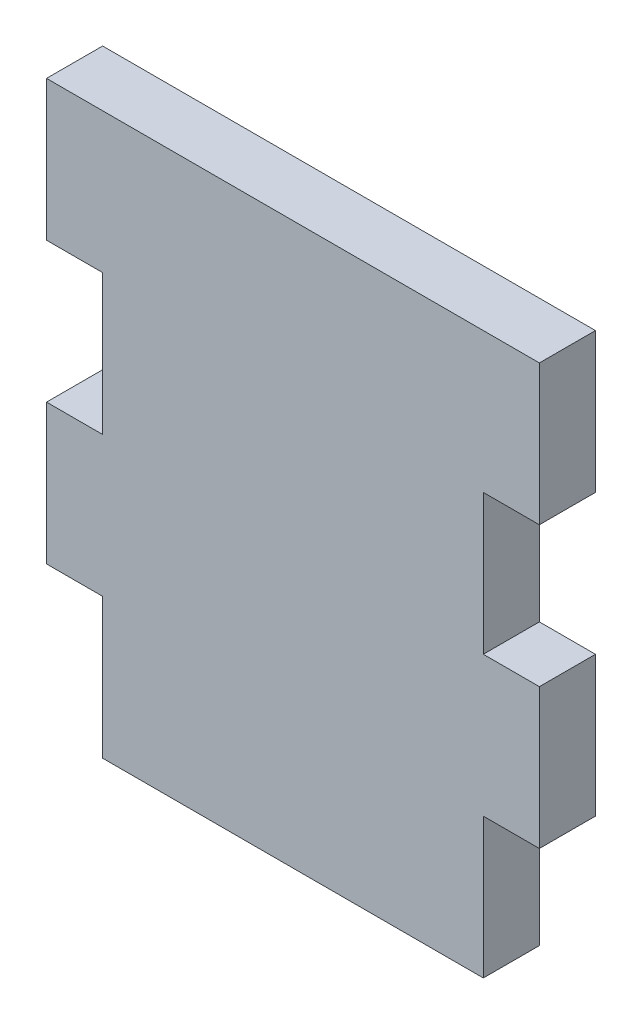
ISO-10303-21;
HEADER;
FILE_DESCRIPTION(('STEP AP214'),'2;1');
FILE_NAME('part.step','',(''),(''),'','','');
FILE_SCHEMA(('AUTOMOTIVE_DESIGN { 1 0 10303 214 1 1 1 1 }'));
ENDSEC;
DATA;
#1=APPLICATION_CONTEXT('core data for automotive mechanical design processes');
#2=APPLICATION_PROTOCOL_DEFINITION('international standard','automotive_design',2000,#1);
#3=PRODUCT_CONTEXT('',#1,'mechanical');
#4=PRODUCT('Part','Part','',(#3));
#5=PRODUCT_RELATED_PRODUCT_CATEGORY('part','',(#4));
#6=PRODUCT_DEFINITION_FORMATION('','',#4);
#7=PRODUCT_DEFINITION_CONTEXT('part definition',#1,'design');
#8=PRODUCT_DEFINITION('design','',#6,#7);
#9=PRODUCT_DEFINITION_SHAPE('','',#8);
#10=(LENGTH_UNIT() NAMED_UNIT(*) SI_UNIT(.MILLI.,.METRE.));
#11=(NAMED_UNIT(*) PLANE_ANGLE_UNIT() SI_UNIT($,.RADIAN.));
#12=(NAMED_UNIT(*) SI_UNIT($,.STERADIAN.) SOLID_ANGLE_UNIT());
#13=UNCERTAINTY_MEASURE_WITH_UNIT(LENGTH_MEASURE(1.E-05),#10,'distance_accuracy_value','');
#14=(GEOMETRIC_REPRESENTATION_CONTEXT(3) GLOBAL_UNCERTAINTY_ASSIGNED_CONTEXT((#13)) GLOBAL_UNIT_ASSIGNED_CONTEXT((#10,
#11,#12)) REPRESENTATION_CONTEXT('',''));
#15=CARTESIAN_POINT('',(0.,0.,0.));
#16=DIRECTION('',(0.,0.,1.));
#17=DIRECTION('',(1.,0.,0.));
#18=AXIS2_PLACEMENT_3D('',#15,#16,#17);
#19=CARTESIAN_POINT('',(-45.6672493245253,14.1108572179902,4.826));
#20=DIRECTION('',(-1.,0.,0.));
#21=DIRECTION('',(0.,-1.,0.));
#22=AXIS2_PLACEMENT_3D('',#19,#20,#21);
#23=PLANE('',#22);
#24=DIRECTION('',(0.,1.,0.));
#25=VECTOR('',#24,1.);
#26=CARTESIAN_POINT('',(-45.6672493245253,14.1108572179902,4.826));
#27=LINE('',#26,#25);
#28=CARTESIAN_POINT('',(-45.6672493245252,-22.0841427820098,4.826));
#29=VERTEX_POINT('',#28);
#30=CARTESIAN_POINT('',(-45.6672493245252,-10.0191427820098,4.826));
#31=VERTEX_POINT('',#30);
#32=EDGE_CURVE('E251',#29,#31,#27,.T.);
#33=ORIENTED_EDGE('',*,*,#32,.F.);
#34=DIRECTION('',(0.,0.,1.));
#35=VECTOR('',#34,1.);
#36=CARTESIAN_POINT('',(-45.6672493245252,-22.0841427820098,0.));
#37=LINE('',#36,#35);
#38=CARTESIAN_POINT('',(-45.6672493245252,-22.0841427820098,0.));
#39=VERTEX_POINT('',#38);
#40=EDGE_CURVE('E170',#39,#29,#37,.T.);
#41=ORIENTED_EDGE('',*,*,#40,.F.);
#42=DIRECTION('',(0.,1.,0.));
#43=VECTOR('',#42,1.);
#44=CARTESIAN_POINT('',(-45.6672493245253,14.1108572179902,0.));
#45=LINE('',#44,#43);
#46=CARTESIAN_POINT('',(-45.6672493245252,-10.0191427820098,0.));
#47=VERTEX_POINT('',#46);
#48=EDGE_CURVE('E164',#39,#47,#45,.T.);
#49=ORIENTED_EDGE('',*,*,#48,.T.);
#50=DIRECTION('',(0.,0.,1.));
#51=VECTOR('',#50,1.);
#52=CARTESIAN_POINT('',(-45.6672493245252,-10.0191427820098,0.));
#53=LINE('',#52,#51);
#54=EDGE_CURVE('E181',#47,#31,#53,.T.);
#55=ORIENTED_EDGE('',*,*,#54,.T.);
#56=EDGE_LOOP('',(#33,#41,#49,#55));
#57=FACE_BOUND('',#56,.T.);
#58=ADVANCED_FACE('F33',(#57),#23,.F.);
#59=CARTESIAN_POINT('',(-88.0852493245253,14.1108572179902,4.826));
#60=DIRECTION('',(1.,0.,0.));
#61=DIRECTION('',(0.,0.,-1.));
#62=AXIS2_PLACEMENT_3D('',#59,#60,#61);
#63=PLANE('',#62);
#64=DIRECTION('',(0.,-1.,0.));
#65=VECTOR('',#64,1.);
#66=CARTESIAN_POINT('',(-88.0852493245253,14.1108572179902,0.));
#67=LINE('',#66,#65);
#68=CARTESIAN_POINT('',(-88.0852493245253,14.1108572179902,0.));
#69=VERTEX_POINT('',#68);
#70=CARTESIAN_POINT('',(-88.0852493245253,2.04585721799016,0.));
#71=VERTEX_POINT('',#70);
#72=EDGE_CURVE('E255',#69,#71,#67,.T.);
#73=ORIENTED_EDGE('',*,*,#72,.T.);
#74=DIRECTION('',(0.,0.,1.));
#75=VECTOR('',#74,1.);
#76=CARTESIAN_POINT('',(-88.0852493245253,2.04585721799016,0.));
#77=LINE('',#76,#75);
#78=CARTESIAN_POINT('',(-88.0852493245253,2.04585721799016,4.826));
#79=VERTEX_POINT('',#78);
#80=EDGE_CURVE('E215',#71,#79,#77,.T.);
#81=ORIENTED_EDGE('',*,*,#80,.T.);
#82=DIRECTION('',(0.,-1.,0.));
#83=VECTOR('',#82,1.);
#84=CARTESIAN_POINT('',(-88.0852493245253,14.1108572179902,4.826));
#85=LINE('',#84,#83);
#86=CARTESIAN_POINT('',(-88.0852493245253,14.1108572179902,4.826));
#87=VERTEX_POINT('',#86);
#88=EDGE_CURVE('E243',#87,#79,#85,.T.);
#89=ORIENTED_EDGE('',*,*,#88,.F.);
#90=DIRECTION('',(0.,0.,-1.));
#91=VECTOR('',#90,1.);
#92=CARTESIAN_POINT('',(-88.0852493245253,14.1108572179902,4.826));
#93=LINE('',#92,#91);
#94=EDGE_CURVE('E41',#87,#69,#93,.T.);
#95=ORIENTED_EDGE('',*,*,#94,.T.);
#96=EDGE_LOOP('',(#73,#81,#89,#95));
#97=FACE_BOUND('',#96,.T.);
#98=ADVANCED_FACE('F268',(#97),#63,.F.);
#99=CARTESIAN_POINT('',(-88.0852493245253,-10.0191427820098,4.826));
#100=VERTEX_POINT('',#99);
#101=CARTESIAN_POINT('',(-88.0852493245253,-22.0841427820098,4.826));
#102=VERTEX_POINT('',#101);
#103=EDGE_CURVE('E247',#100,#102,#85,.T.);
#104=ORIENTED_EDGE('',*,*,#103,.F.);
#105=DIRECTION('',(0.,0.,1.));
#106=VECTOR('',#105,1.);
#107=CARTESIAN_POINT('',(-88.0852493245253,-10.0191427820098,0.));
#108=LINE('',#107,#106);
#109=CARTESIAN_POINT('',(-88.0852493245253,-10.0191427820098,0.));
#110=VERTEX_POINT('',#109);
#111=EDGE_CURVE('E208',#110,#100,#108,.T.);
#112=ORIENTED_EDGE('',*,*,#111,.F.);
#113=CARTESIAN_POINT('',(-88.0852493245253,-22.0841427820098,0.));
#114=VERTEX_POINT('',#113);
#115=EDGE_CURVE('E239',#110,#114,#67,.T.);
#116=ORIENTED_EDGE('',*,*,#115,.T.);
#117=DIRECTION('',(0.,0.,1.));
#118=VECTOR('',#117,1.);
#119=CARTESIAN_POINT('',(-88.0852493245253,-22.0841427820098,0.));
#120=LINE('',#119,#118);
#121=EDGE_CURVE('E236',#114,#102,#120,.T.);
#122=ORIENTED_EDGE('',*,*,#121,.T.);
#123=EDGE_LOOP('',(#104,#112,#116,#122));
#124=FACE_BOUND('',#123,.T.);
#125=ADVANCED_FACE('F35',(#124),#63,.F.);
#126=CARTESIAN_POINT('',(-88.0852493245253,-34.1491427820098,4.826));
#127=DIRECTION('',(0.,1.,0.));
#128=DIRECTION('',(0.,0.,1.));
#129=AXIS2_PLACEMENT_3D('',#126,#127,#128);
#130=PLANE('',#129);
#131=DIRECTION('',(1.,0.,0.));
#132=VECTOR('',#131,1.);
#133=CARTESIAN_POINT('',(-88.0852493245253,-34.1491427820098,0.));
#134=LINE('',#133,#132);
#135=CARTESIAN_POINT('',(-83.2592493245253,-34.1491427820098,0.));
#136=VERTEX_POINT('',#135);
#137=CARTESIAN_POINT('',(-50.4932493245252,-34.1491427820098,0.));
#138=VERTEX_POINT('',#137);
#139=EDGE_CURVE('E258',#136,#138,#134,.T.);
#140=ORIENTED_EDGE('',*,*,#139,.T.);
#141=DIRECTION('',(0.,0.,1.));
#142=VECTOR('',#141,1.);
#143=CARTESIAN_POINT('',(-50.4932493245252,-34.1491427820098,0.));
#144=LINE('',#143,#142);
#145=CARTESIAN_POINT('',(-50.4932493245252,-34.1491427820098,4.826));
#146=VERTEX_POINT('',#145);
#147=EDGE_CURVE('E48',#138,#146,#144,.T.);
#148=ORIENTED_EDGE('',*,*,#147,.T.);
#149=DIRECTION('',(1.,0.,0.));
#150=VECTOR('',#149,1.);
#151=CARTESIAN_POINT('',(-88.0852493245253,-34.1491427820098,4.826));
#152=LINE('',#151,#150);
#153=CARTESIAN_POINT('',(-83.2592493245253,-34.1491427820098,4.826));
#154=VERTEX_POINT('',#153);
#155=EDGE_CURVE('E246',#154,#146,#152,.T.);
#156=ORIENTED_EDGE('',*,*,#155,.F.);
#157=DIRECTION('',(0.,0.,1.));
#158=VECTOR('',#157,1.);
#159=CARTESIAN_POINT('',(-83.2592493245253,-34.1491427820098,0.));
#160=LINE('',#159,#158);
#161=EDGE_CURVE('E231',#136,#154,#160,.T.);
#162=ORIENTED_EDGE('',*,*,#161,.F.);
#163=EDGE_LOOP('',(#140,#148,#156,#162));
#164=FACE_BOUND('',#163,.T.);
#165=ADVANCED_FACE('F301',(#164),#130,.F.);
#166=CARTESIAN_POINT('',(-45.6672493245252,2.04585721799016,4.826));
#167=VERTEX_POINT('',#166);
#168=CARTESIAN_POINT('',(-45.6672493245253,14.1108572179902,4.826));
#169=VERTEX_POINT('',#168);
#170=EDGE_CURVE('E250',#167,#169,#27,.T.);
#171=ORIENTED_EDGE('',*,*,#170,.F.);
#172=DIRECTION('',(0.,0.,1.));
#173=VECTOR('',#172,1.);
#174=CARTESIAN_POINT('',(-45.6672493245252,2.04585721799016,0.));
#175=LINE('',#174,#173);
#176=CARTESIAN_POINT('',(-45.6672493245252,2.04585721799016,0.));
#177=VERTEX_POINT('',#176);
#178=EDGE_CURVE('E194',#177,#167,#175,.T.);
#179=ORIENTED_EDGE('',*,*,#178,.F.);
#180=CARTESIAN_POINT('',(-45.6672493245253,14.1108572179902,0.));
#181=VERTEX_POINT('',#180);
#182=EDGE_CURVE('E260',#177,#181,#45,.T.);
#183=ORIENTED_EDGE('',*,*,#182,.T.);
#184=DIRECTION('',(0.,0.,-1.));
#185=VECTOR('',#184,1.);
#186=CARTESIAN_POINT('',(-45.6672493245253,14.1108572179902,4.826));
#187=LINE('',#186,#185);
#188=EDGE_CURVE('E11',#169,#181,#187,.T.);
#189=ORIENTED_EDGE('',*,*,#188,.F.);
#190=EDGE_LOOP('',(#171,#179,#183,#189));
#191=FACE_BOUND('',#190,.T.);
#192=ADVANCED_FACE('F285',(#191),#23,.F.);
#193=CARTESIAN_POINT('',(-88.0852493245253,14.1108572179902,4.826));
#194=DIRECTION('',(0.,-1.,0.));
#195=DIRECTION('',(0.,0.,-1.));
#196=AXIS2_PLACEMENT_3D('',#193,#194,#195);
#197=PLANE('',#196);
#198=DIRECTION('',(-1.,0.,0.));
#199=VECTOR('',#198,1.);
#200=CARTESIAN_POINT('',(-88.0852493245253,14.1108572179902,0.));
#201=LINE('',#200,#199);
#202=EDGE_CURVE('E262',#181,#69,#201,.T.);
#203=ORIENTED_EDGE('',*,*,#202,.T.);
#204=ORIENTED_EDGE('',*,*,#94,.F.);
#205=DIRECTION('',(-1.,0.,0.));
#206=VECTOR('',#205,1.);
#207=CARTESIAN_POINT('',(-88.0852493245253,14.1108572179902,4.826));
#208=LINE('',#207,#206);
#209=EDGE_CURVE('E253',#169,#87,#208,.T.);
#210=ORIENTED_EDGE('',*,*,#209,.F.);
#211=ORIENTED_EDGE('',*,*,#188,.T.);
#212=EDGE_LOOP('',(#203,#204,#210,#211));
#213=FACE_BOUND('',#212,.T.);
#214=ADVANCED_FACE('F283',(#213),#197,.F.);
#215=CARTESIAN_POINT('',(0.,0.,4.826));
#216=DIRECTION('',(0.,0.,1.));
#217=DIRECTION('',(1.,0.,0.));
#218=AXIS2_PLACEMENT_3D('',#215,#216,#217);
#219=PLANE('',#218);
#220=DIRECTION('',(-1.,0.,0.));
#221=VECTOR('',#220,1.);
#222=CARTESIAN_POINT('',(-45.6672493245252,-22.0841427820098,4.826));
#223=LINE('',#222,#221);
#224=CARTESIAN_POINT('',(-50.4932493245252,-22.0841427820098,4.826));
#225=VERTEX_POINT('',#224);
#226=EDGE_CURVE('E152',#29,#225,#223,.T.);
#227=ORIENTED_EDGE('',*,*,#226,.F.);
#228=ORIENTED_EDGE('',*,*,#32,.T.);
#229=DIRECTION('',(1.,0.,0.));
#230=VECTOR('',#229,1.);
#231=CARTESIAN_POINT('',(-45.6672493245252,-10.0191427820098,4.826));
#232=LINE('',#231,#230);
#233=CARTESIAN_POINT('',(-50.4932493245252,-10.0191427820098,4.826));
#234=VERTEX_POINT('',#233);
#235=EDGE_CURVE('E172',#234,#31,#232,.T.);
#236=ORIENTED_EDGE('',*,*,#235,.F.);
#237=DIRECTION('',(0.,-1.,0.));
#238=VECTOR('',#237,1.);
#239=CARTESIAN_POINT('',(-50.4932493245252,-10.0191427820098,4.826));
#240=LINE('',#239,#238);
#241=CARTESIAN_POINT('',(-50.4932493245252,2.04585721799016,4.826));
#242=VERTEX_POINT('',#241);
#243=EDGE_CURVE('E177',#242,#234,#240,.T.);
#244=ORIENTED_EDGE('',*,*,#243,.F.);
#245=DIRECTION('',(-1.,0.,0.));
#246=VECTOR('',#245,1.);
#247=CARTESIAN_POINT('',(-45.6672493245252,2.04585721799016,4.826));
#248=LINE('',#247,#246);
#249=EDGE_CURVE('E184',#167,#242,#248,.T.);
#250=ORIENTED_EDGE('',*,*,#249,.F.);
#251=ORIENTED_EDGE('',*,*,#170,.T.);
#252=ORIENTED_EDGE('',*,*,#209,.T.);
#253=ORIENTED_EDGE('',*,*,#88,.T.);
#254=DIRECTION('',(-1.,0.,0.));
#255=VECTOR('',#254,1.);
#256=CARTESIAN_POINT('',(-88.0852493245253,2.04585721799016,4.826));
#257=LINE('',#256,#255);
#258=CARTESIAN_POINT('',(-83.2592493245253,2.04585721799016,4.826));
#259=VERTEX_POINT('',#258);
#260=EDGE_CURVE('E202',#259,#79,#257,.T.);
#261=ORIENTED_EDGE('',*,*,#260,.F.);
#262=DIRECTION('',(0.,1.,0.));
#263=VECTOR('',#262,1.);
#264=CARTESIAN_POINT('',(-83.2592493245253,-10.0191427820098,4.826));
#265=LINE('',#264,#263);
#266=CARTESIAN_POINT('',(-83.2592493245253,-10.0191427820098,4.826));
#267=VERTEX_POINT('',#266);
#268=EDGE_CURVE('E211',#267,#259,#265,.T.);
#269=ORIENTED_EDGE('',*,*,#268,.F.);
#270=DIRECTION('',(1.,0.,0.));
#271=VECTOR('',#270,1.);
#272=CARTESIAN_POINT('',(-88.0852493245253,-10.0191427820098,4.826));
#273=LINE('',#272,#271);
#274=EDGE_CURVE('E191',#100,#267,#273,.T.);
#275=ORIENTED_EDGE('',*,*,#274,.F.);
#276=ORIENTED_EDGE('',*,*,#103,.T.);
#277=DIRECTION('',(-1.,0.,0.));
#278=VECTOR('',#277,1.);
#279=CARTESIAN_POINT('',(-88.0852493245253,-22.0841427820098,4.826));
#280=LINE('',#279,#278);
#281=CARTESIAN_POINT('',(-83.2592493245253,-22.0841427820098,4.826));
#282=VERTEX_POINT('',#281);
#283=EDGE_CURVE('E228',#282,#102,#280,.T.);
#284=ORIENTED_EDGE('',*,*,#283,.F.);
#285=DIRECTION('',(0.,1.,0.));
#286=VECTOR('',#285,1.);
#287=CARTESIAN_POINT('',(-83.2592493245253,-34.1491427820098,4.826));
#288=LINE('',#287,#286);
#289=EDGE_CURVE('E218',#154,#282,#288,.T.);
#290=ORIENTED_EDGE('',*,*,#289,.F.);
#291=ORIENTED_EDGE('',*,*,#155,.T.);
#292=DIRECTION('',(0.,-1.,0.));
#293=VECTOR('',#292,1.);
#294=CARTESIAN_POINT('',(-50.4932493245252,-34.1491427820098,4.826));
#295=LINE('',#294,#293);
#296=EDGE_CURVE('E165',#225,#146,#295,.T.);
#297=ORIENTED_EDGE('',*,*,#296,.F.);
#298=EDGE_LOOP('',(#227,#228,#236,#244,#250,#251,#252,#253,#261,#269,#275,#276,#284,#290,#291,#297));
#299=FACE_BOUND('',#298,.T.);
#300=ADVANCED_FACE('F278',(#299),#219,.T.);
#301=CARTESIAN_POINT('',(0.,0.,0.));
#302=DIRECTION('',(0.,0.,1.));
#303=DIRECTION('',(1.,0.,0.));
#304=AXIS2_PLACEMENT_3D('',#301,#302,#303);
#305=PLANE('',#304);
#306=ORIENTED_EDGE('',*,*,#48,.F.);
#307=DIRECTION('',(-1.,0.,0.));
#308=VECTOR('',#307,1.);
#309=CARTESIAN_POINT('',(-45.6672493245252,-22.0841427820098,0.));
#310=LINE('',#309,#308);
#311=CARTESIAN_POINT('',(-50.4932493245252,-22.0841427820098,0.));
#312=VERTEX_POINT('',#311);
#313=EDGE_CURVE('E149',#39,#312,#310,.T.);
#314=ORIENTED_EDGE('',*,*,#313,.T.);
#315=DIRECTION('',(0.,-1.,0.));
#316=VECTOR('',#315,1.);
#317=CARTESIAN_POINT('',(-50.4932493245252,-34.1491427820098,0.));
#318=LINE('',#317,#316);
#319=EDGE_CURVE('E154',#312,#138,#318,.T.);
#320=ORIENTED_EDGE('',*,*,#319,.T.);
#321=ORIENTED_EDGE('',*,*,#139,.F.);
#322=DIRECTION('',(0.,1.,0.));
#323=VECTOR('',#322,1.);
#324=CARTESIAN_POINT('',(-83.2592493245253,-34.1491427820098,0.));
#325=LINE('',#324,#323);
#326=CARTESIAN_POINT('',(-83.2592493245253,-22.0841427820098,0.));
#327=VERTEX_POINT('',#326);
#328=EDGE_CURVE('E224',#136,#327,#325,.T.);
#329=ORIENTED_EDGE('',*,*,#328,.T.);
#330=DIRECTION('',(-1.,0.,0.));
#331=VECTOR('',#330,1.);
#332=CARTESIAN_POINT('',(-88.0852493245253,-22.0841427820098,0.));
#333=LINE('',#332,#331);
#334=EDGE_CURVE('E227',#327,#114,#333,.T.);
#335=ORIENTED_EDGE('',*,*,#334,.T.);
#336=ORIENTED_EDGE('',*,*,#115,.F.);
#337=DIRECTION('',(1.,0.,0.));
#338=VECTOR('',#337,1.);
#339=CARTESIAN_POINT('',(-88.0852493245253,-10.0191427820098,0.));
#340=LINE('',#339,#338);
#341=CARTESIAN_POINT('',(-83.2592493245253,-10.0191427820098,0.));
#342=VERTEX_POINT('',#341);
#343=EDGE_CURVE('E198',#110,#342,#340,.T.);
#344=ORIENTED_EDGE('',*,*,#343,.T.);
#345=DIRECTION('',(0.,1.,0.));
#346=VECTOR('',#345,1.);
#347=CARTESIAN_POINT('',(-83.2592493245253,-10.0191427820098,0.));
#348=LINE('',#347,#346);
#349=CARTESIAN_POINT('',(-83.2592493245253,2.04585721799016,0.));
#350=VERTEX_POINT('',#349);
#351=EDGE_CURVE('E201',#342,#350,#348,.T.);
#352=ORIENTED_EDGE('',*,*,#351,.T.);
#353=DIRECTION('',(-1.,0.,0.));
#354=VECTOR('',#353,1.);
#355=CARTESIAN_POINT('',(-88.0852493245253,2.04585721799016,0.));
#356=LINE('',#355,#354);
#357=EDGE_CURVE('E205',#350,#71,#356,.T.);
#358=ORIENTED_EDGE('',*,*,#357,.T.);
#359=ORIENTED_EDGE('',*,*,#72,.F.);
#360=ORIENTED_EDGE('',*,*,#202,.F.);
#361=ORIENTED_EDGE('',*,*,#182,.F.);
#362=DIRECTION('',(-1.,0.,0.));
#363=VECTOR('',#362,1.);
#364=CARTESIAN_POINT('',(-45.6672493245252,2.04585721799016,0.));
#365=LINE('',#364,#363);
#366=CARTESIAN_POINT('',(-50.4932493245252,2.04585721799016,0.));
#367=VERTEX_POINT('',#366);
#368=EDGE_CURVE('E176',#177,#367,#365,.T.);
#369=ORIENTED_EDGE('',*,*,#368,.T.);
#370=DIRECTION('',(0.,-1.,0.));
#371=VECTOR('',#370,1.);
#372=CARTESIAN_POINT('',(-50.4932493245252,-10.0191427820098,0.));
#373=LINE('',#372,#371);
#374=CARTESIAN_POINT('',(-50.4932493245252,-10.0191427820098,0.));
#375=VERTEX_POINT('',#374);
#376=EDGE_CURVE('E56',#367,#375,#373,.T.);
#377=ORIENTED_EDGE('',*,*,#376,.T.);
#378=DIRECTION('',(1.,0.,0.));
#379=VECTOR('',#378,1.);
#380=CARTESIAN_POINT('',(-45.6672493245252,-10.0191427820098,0.));
#381=LINE('',#380,#379);
#382=EDGE_CURVE('E174',#375,#47,#381,.T.);
#383=ORIENTED_EDGE('',*,*,#382,.T.);
#384=EDGE_LOOP('',(#306,#314,#320,#321,#329,#335,#336,#344,#352,#358,#359,#360,#361,#369,#377,#383));
#385=FACE_BOUND('',#384,.T.);
#386=ADVANCED_FACE('F162',(#385),#305,.F.);
#387=CARTESIAN_POINT('',(-88.0852493245253,-22.0841427820098,0.));
#388=DIRECTION('',(0.,1.,0.));
#389=DIRECTION('',(0.,0.,1.));
#390=AXIS2_PLACEMENT_3D('',#387,#388,#389);
#391=PLANE('',#390);
#392=ORIENTED_EDGE('',*,*,#283,.T.);
#393=ORIENTED_EDGE('',*,*,#121,.F.);
#394=ORIENTED_EDGE('',*,*,#334,.F.);
#395=DIRECTION('',(0.,0.,1.));
#396=VECTOR('',#395,1.);
#397=CARTESIAN_POINT('',(-83.2592493245253,-22.0841427820098,0.));
#398=LINE('',#397,#396);
#399=EDGE_CURVE('E240',#327,#282,#398,.T.);
#400=ORIENTED_EDGE('',*,*,#399,.T.);
#401=EDGE_LOOP('',(#392,#393,#394,#400));
#402=FACE_BOUND('',#401,.T.);
#403=ADVANCED_FACE('F309',(#402),#391,.F.);
#404=CARTESIAN_POINT('',(-83.2592493245253,-34.1491427820098,0.));
#405=DIRECTION('',(1.,0.,0.));
#406=DIRECTION('',(0.,0.,-1.));
#407=AXIS2_PLACEMENT_3D('',#404,#405,#406);
#408=PLANE('',#407);
#409=ORIENTED_EDGE('',*,*,#289,.T.);
#410=ORIENTED_EDGE('',*,*,#399,.F.);
#411=ORIENTED_EDGE('',*,*,#328,.F.);
#412=ORIENTED_EDGE('',*,*,#161,.T.);
#413=EDGE_LOOP('',(#409,#410,#411,#412));
#414=FACE_BOUND('',#413,.T.);
#415=ADVANCED_FACE('F306',(#414),#408,.F.);
#416=CARTESIAN_POINT('',(-88.0852493245253,2.04585721799016,0.));
#417=DIRECTION('',(0.,1.,0.));
#418=DIRECTION('',(-1.,0.,0.));
#419=AXIS2_PLACEMENT_3D('',#416,#417,#418);
#420=PLANE('',#419);
#421=ORIENTED_EDGE('',*,*,#260,.T.);
#422=ORIENTED_EDGE('',*,*,#80,.F.);
#423=ORIENTED_EDGE('',*,*,#357,.F.);
#424=DIRECTION('',(0.,0.,1.));
#425=VECTOR('',#424,1.);
#426=CARTESIAN_POINT('',(-83.2592493245253,2.04585721799016,0.));
#427=LINE('',#426,#425);
#428=EDGE_CURVE('E219',#350,#259,#427,.T.);
#429=ORIENTED_EDGE('',*,*,#428,.T.);
#430=EDGE_LOOP('',(#421,#422,#423,#429));
#431=FACE_BOUND('',#430,.T.);
#432=ADVANCED_FACE('F275',(#431),#420,.F.);
#433=CARTESIAN_POINT('',(-83.2592493245253,-10.0191427820098,0.));
#434=DIRECTION('',(1.,0.,0.));
#435=DIRECTION('',(0.,0.,-1.));
#436=AXIS2_PLACEMENT_3D('',#433,#434,#435);
#437=PLANE('',#436);
#438=ORIENTED_EDGE('',*,*,#268,.T.);
#439=ORIENTED_EDGE('',*,*,#428,.F.);
#440=ORIENTED_EDGE('',*,*,#351,.F.);
#441=DIRECTION('',(0.,0.,1.));
#442=VECTOR('',#441,1.);
#443=CARTESIAN_POINT('',(-83.2592493245253,-10.0191427820098,0.));
#444=LINE('',#443,#442);
#445=EDGE_CURVE('E221',#342,#267,#444,.T.);
#446=ORIENTED_EDGE('',*,*,#445,.T.);
#447=EDGE_LOOP('',(#438,#439,#440,#446));
#448=FACE_BOUND('',#447,.T.);
#449=ADVANCED_FACE('F319',(#448),#437,.F.);
#450=CARTESIAN_POINT('',(-88.0852493245253,-10.0191427820098,0.));
#451=DIRECTION('',(0.,-1.,0.));
#452=DIRECTION('',(0.,0.,-1.));
#453=AXIS2_PLACEMENT_3D('',#450,#451,#452);
#454=PLANE('',#453);
#455=ORIENTED_EDGE('',*,*,#274,.T.);
#456=ORIENTED_EDGE('',*,*,#445,.F.);
#457=ORIENTED_EDGE('',*,*,#343,.F.);
#458=ORIENTED_EDGE('',*,*,#111,.T.);
#459=EDGE_LOOP('',(#455,#456,#457,#458));
#460=FACE_BOUND('',#459,.T.);
#461=ADVANCED_FACE('F316',(#460),#454,.F.);
#462=CARTESIAN_POINT('',(-45.6672493245252,-10.0191427820098,0.));
#463=DIRECTION('',(0.,-1.,0.));
#464=DIRECTION('',(1.,0.,0.));
#465=AXIS2_PLACEMENT_3D('',#462,#463,#464);
#466=PLANE('',#465);
#467=ORIENTED_EDGE('',*,*,#235,.T.);
#468=ORIENTED_EDGE('',*,*,#54,.F.);
#469=ORIENTED_EDGE('',*,*,#382,.F.);
#470=DIRECTION('',(0.,0.,1.));
#471=VECTOR('',#470,1.);
#472=CARTESIAN_POINT('',(-50.4932493245252,-10.0191427820098,0.));
#473=LINE('',#472,#471);
#474=EDGE_CURVE('E189',#375,#234,#473,.T.);
#475=ORIENTED_EDGE('',*,*,#474,.T.);
#476=EDGE_LOOP('',(#467,#468,#469,#475));
#477=FACE_BOUND('',#476,.T.);
#478=ADVANCED_FACE('F296',(#477),#466,.F.);
#479=CARTESIAN_POINT('',(-50.4932493245252,-10.0191427820098,0.));
#480=DIRECTION('',(-1.,0.,0.));
#481=DIRECTION('',(0.,-1.,0.));
#482=AXIS2_PLACEMENT_3D('',#479,#480,#481);
#483=PLANE('',#482);
#484=ORIENTED_EDGE('',*,*,#243,.T.);
#485=ORIENTED_EDGE('',*,*,#474,.F.);
#486=ORIENTED_EDGE('',*,*,#376,.F.);
#487=DIRECTION('',(0.,0.,1.));
#488=VECTOR('',#487,1.);
#489=CARTESIAN_POINT('',(-50.4932493245252,2.04585721799016,0.));
#490=LINE('',#489,#488);
#491=EDGE_CURVE('E192',#367,#242,#490,.T.);
#492=ORIENTED_EDGE('',*,*,#491,.T.);
#493=EDGE_LOOP('',(#484,#485,#486,#492));
#494=FACE_BOUND('',#493,.T.);
#495=ADVANCED_FACE('F290',(#494),#483,.F.);
#496=CARTESIAN_POINT('',(-45.6672493245252,2.04585721799016,0.));
#497=DIRECTION('',(0.,1.,0.));
#498=DIRECTION('',(-1.,0.,0.));
#499=AXIS2_PLACEMENT_3D('',#496,#497,#498);
#500=PLANE('',#499);
#501=ORIENTED_EDGE('',*,*,#249,.T.);
#502=ORIENTED_EDGE('',*,*,#491,.F.);
#503=ORIENTED_EDGE('',*,*,#368,.F.);
#504=ORIENTED_EDGE('',*,*,#178,.T.);
#505=EDGE_LOOP('',(#501,#502,#503,#504));
#506=FACE_BOUND('',#505,.T.);
#507=ADVANCED_FACE('F288',(#506),#500,.F.);
#508=CARTESIAN_POINT('',(-45.6672493245252,-22.0841427820098,0.));
#509=DIRECTION('',(0.,1.,0.));
#510=DIRECTION('',(0.,0.,1.));
#511=AXIS2_PLACEMENT_3D('',#508,#509,#510);
#512=PLANE('',#511);
#513=ORIENTED_EDGE('',*,*,#226,.T.);
#514=DIRECTION('',(0.,0.,1.));
#515=VECTOR('',#514,1.);
#516=CARTESIAN_POINT('',(-50.4932493245252,-22.0841427820098,0.));
#517=LINE('',#516,#515);
#518=EDGE_CURVE('E146',#312,#225,#517,.T.);
#519=ORIENTED_EDGE('',*,*,#518,.F.);
#520=ORIENTED_EDGE('',*,*,#313,.F.);
#521=ORIENTED_EDGE('',*,*,#40,.T.);
#522=EDGE_LOOP('',(#513,#519,#520,#521));
#523=FACE_BOUND('',#522,.T.);
#524=ADVANCED_FACE('F147',(#523),#512,.F.);
#525=CARTESIAN_POINT('',(-50.4932493245252,-34.1491427820098,0.));
#526=DIRECTION('',(-1.,0.,0.));
#527=DIRECTION('',(0.,-1.,0.));
#528=AXIS2_PLACEMENT_3D('',#525,#526,#527);
#529=PLANE('',#528);
#530=ORIENTED_EDGE('',*,*,#296,.T.);
#531=ORIENTED_EDGE('',*,*,#147,.F.);
#532=ORIENTED_EDGE('',*,*,#319,.F.);
#533=ORIENTED_EDGE('',*,*,#518,.T.);
#534=EDGE_LOOP('',(#530,#531,#532,#533));
#535=FACE_BOUND('',#534,.T.);
#536=ADVANCED_FACE('F156',(#535),#529,.F.);
#537=CLOSED_SHELL('',(#58,#98,#125,#165,#192,#214,#300,#386,#403,#415,#432,#449,#461,#478,#495,
#507,#524,#536));
#538=MANIFOLD_SOLID_BREP('B2',#537);
#539=ADVANCED_BREP_SHAPE_REPRESENTATION('',(#18,#538),#14);
#540=SHAPE_DEFINITION_REPRESENTATION(#9,#539);
ENDSEC;
END-ISO-10303-21;
